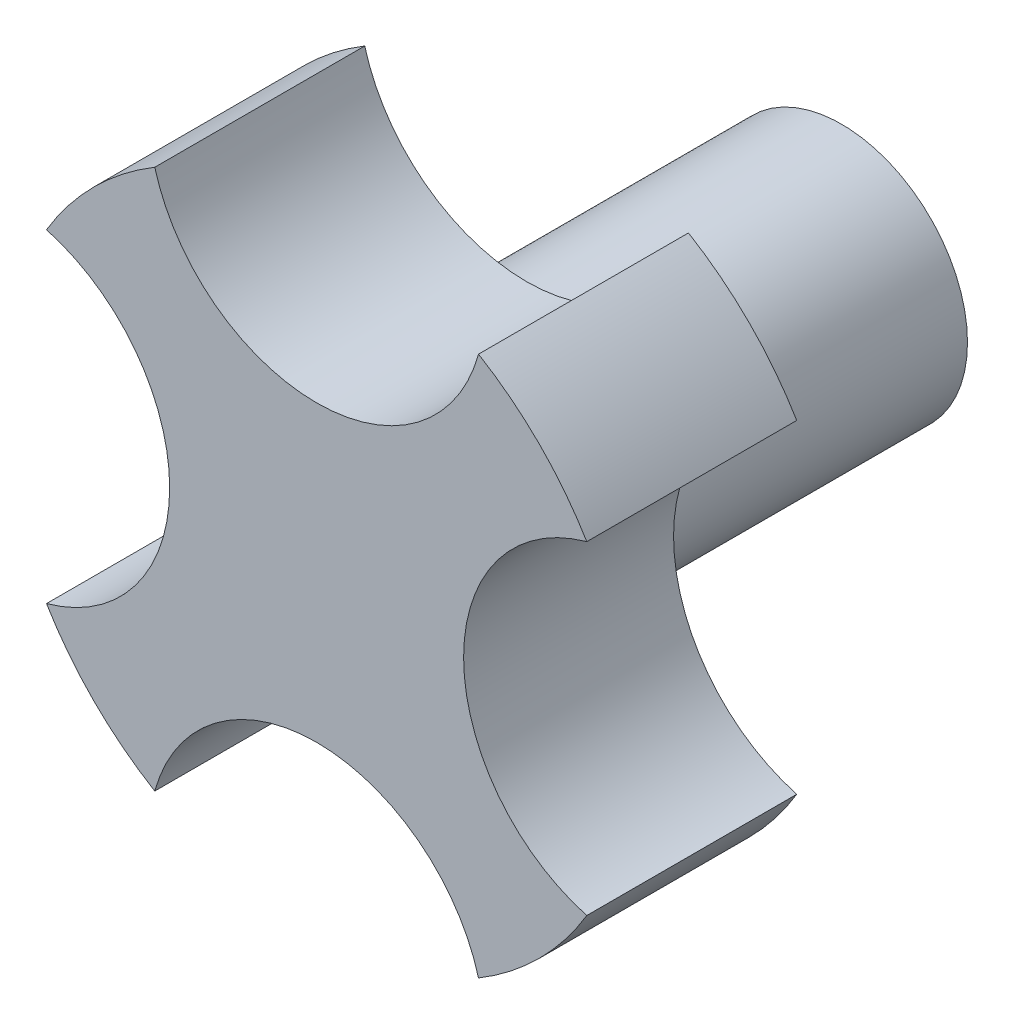
ISO-10303-21;
HEADER;
FILE_DESCRIPTION(('STEP AP214'),'2;1');
FILE_NAME('part.step','',(''),(''),'','','');
FILE_SCHEMA(('AUTOMOTIVE_DESIGN { 1 0 10303 214 1 1 1 1 }'));
ENDSEC;
DATA;
#1=APPLICATION_CONTEXT('core data for automotive mechanical design processes');
#2=APPLICATION_PROTOCOL_DEFINITION('international standard','automotive_design',2000,#1);
#3=PRODUCT_CONTEXT('',#1,'mechanical');
#4=PRODUCT('Part','Part','',(#3));
#5=PRODUCT_RELATED_PRODUCT_CATEGORY('part','',(#4));
#6=PRODUCT_DEFINITION_FORMATION('','',#4);
#7=PRODUCT_DEFINITION_CONTEXT('part definition',#1,'design');
#8=PRODUCT_DEFINITION('design','',#6,#7);
#9=PRODUCT_DEFINITION_SHAPE('','',#8);
#10=(LENGTH_UNIT() NAMED_UNIT(*) SI_UNIT(.MILLI.,.METRE.));
#11=(NAMED_UNIT(*) PLANE_ANGLE_UNIT() SI_UNIT($,.RADIAN.));
#12=(NAMED_UNIT(*) SI_UNIT($,.STERADIAN.) SOLID_ANGLE_UNIT());
#13=UNCERTAINTY_MEASURE_WITH_UNIT(LENGTH_MEASURE(1.E-05),#10,'distance_accuracy_value','');
#14=(GEOMETRIC_REPRESENTATION_CONTEXT(3) GLOBAL_UNCERTAINTY_ASSIGNED_CONTEXT((#13)) GLOBAL_UNIT_ASSIGNED_CONTEXT((#10,
#11,#12)) REPRESENTATION_CONTEXT('',''));
#15=CARTESIAN_POINT('',(0.,0.,0.));
#16=DIRECTION('',(0.,0.,1.));
#17=DIRECTION('',(1.,0.,0.));
#18=AXIS2_PLACEMENT_3D('',#15,#16,#17);
#19=CARTESIAN_POINT('',(0.,0.,0.));
#20=DIRECTION('',(0.,0.,1.));
#21=DIRECTION('',(1.,0.,0.));
#22=AXIS2_PLACEMENT_3D('',#19,#20,#21);
#23=PLANE('',#22);
#24=CARTESIAN_POINT('',(0.,0.,0.));
#25=DIRECTION('',(0.,0.,1.));
#26=DIRECTION('',(1.,0.,0.));
#27=AXIS2_PLACEMENT_3D('',#24,#25,#26);
#28=CIRCLE('',#27,6.);
#29=CARTESIAN_POINT('',(6.,0.,0.));
#30=VERTEX_POINT('',#29);
#31=EDGE_CURVE('E51',#30,#30,#28,.T.);
#32=ORIENTED_EDGE('',*,*,#31,.F.);
#33=EDGE_LOOP('',(#32));
#34=FACE_BOUND('',#33,.T.);
#35=CARTESIAN_POINT('',(0.,0.,0.));
#36=DIRECTION('',(0.,0.,1.));
#37=DIRECTION('',(1.,0.,0.));
#38=AXIS2_PLACEMENT_3D('',#35,#36,#37);
#39=CIRCLE('',#38,4.);
#40=CARTESIAN_POINT('',(4.,0.,0.));
#41=VERTEX_POINT('',#40);
#42=EDGE_CURVE('E174',#41,#41,#39,.T.);
#43=ORIENTED_EDGE('',*,*,#42,.T.);
#44=EDGE_LOOP('',(#43));
#45=FACE_BOUND('',#44,.T.);
#46=ADVANCED_FACE('F35',(#34,#45),#23,.F.);
#47=CARTESIAN_POINT('',(0.,0.,15.));
#48=DIRECTION('',(0.,0.,-1.));
#49=DIRECTION('',(-1.,0.,0.));
#50=AXIS2_PLACEMENT_3D('',#47,#48,#49);
#51=CYLINDRICAL_SURFACE('',#50,6.);
#52=CARTESIAN_POINT('',(-6.,0.,9.));
#53=CARTESIAN_POINT('',(-5.99999859868013,-0.0828760886697312,8.99999767426184));
#54=CARTESIAN_POINT('',(-5.99826578131828,-0.165778157830763,8.99310844922621));
#55=CARTESIAN_POINT('',(-5.99152113829892,-0.329206323770533,8.96577484869299));
#56=CARTESIAN_POINT('',(-5.98650745419968,-0.409731046870739,8.94532279046215));
#57=CARTESIAN_POINT('',(-5.9737562633204,-0.566020872182576,8.8915607465379));
#58=CARTESIAN_POINT('',(-5.96602202842087,-0.641791563430002,8.85826620128471));
#59=CARTESIAN_POINT('',(-5.94865343807593,-0.786672131904424,8.77981860995515));
#60=CARTESIAN_POINT('',(-5.9390190185405,-0.855781784348756,8.73466516388105));
#61=CARTESIAN_POINT('',(-5.91867413591801,-0.986801927300915,8.63279921034577));
#62=CARTESIAN_POINT('',(-5.90794707148533,-1.04855569006107,8.57588842504081));
#63=CARTESIAN_POINT('',(-5.8867362011753,-1.1617489272033,8.45254779509107));
#64=CARTESIAN_POINT('',(-5.87625242288349,-1.21318723694913,8.38611687705349));
#65=CARTESIAN_POINT('',(-5.85654775699711,-1.30502654279902,8.24440477326254));
#66=CARTESIAN_POINT('',(-5.84734794470605,-1.34525221592535,8.16900676918957));
#67=CARTESIAN_POINT('',(-5.83149494812224,-1.41239690855051,8.01225158834162));
#68=CARTESIAN_POINT('',(-5.82484135672789,-1.43931805543932,7.93089536667422));
#69=CARTESIAN_POINT('',(-5.81500476717551,-1.47855483680427,7.7662565017975));
#70=CARTESIAN_POINT('',(-5.81175491075426,-1.49115226833332,7.68304510395018));
#71=CARTESIAN_POINT('',(-5.80889362537741,-1.50226177506783,7.515631430986));
#72=CARTESIAN_POINT('',(-5.80928160448644,-1.50077614181796,7.43142931930137));
#73=CARTESIAN_POINT('',(-5.81359205496619,-1.48398652463926,7.2665841922555));
#74=CARTESIAN_POINT('',(-5.8174286300188,-1.46901834019049,7.18590437853488));
#75=CARTESIAN_POINT('',(-5.82806709676484,-1.42622418690308,7.02823894908868));
#76=CARTESIAN_POINT('',(-5.83486919970697,-1.39839730206939,6.95125359697099));
#77=CARTESIAN_POINT('',(-5.85075113904187,-1.33038947793712,6.80226198374791));
#78=CARTESIAN_POINT('',(-5.85985327469422,-1.29008666723288,6.73031382821043));
#79=CARTESIAN_POINT('',(-5.87929710846387,-1.19835627601492,6.59408129024314));
#80=CARTESIAN_POINT('',(-5.88963902334736,-1.1469267488088,6.52979825193273));
#81=CARTESIAN_POINT('',(-5.91075880539782,-1.03266342468118,6.40879638430558));
#82=CARTESIAN_POINT('',(-5.92154069477972,-0.969546258165819,6.35234550993863));
#83=CARTESIAN_POINT('',(-5.94205965578786,-0.834611917503658,6.25077875753608));
#84=CARTESIAN_POINT('',(-5.95179669549416,-0.762794477707901,6.20566322573642));
#85=CARTESIAN_POINT('',(-5.96917732094183,-0.612115888681348,6.1279494137756));
#86=CARTESIAN_POINT('',(-5.97681360127726,-0.533231393208579,6.09539465974556));
#87=CARTESIAN_POINT('',(-5.98907916991419,-0.370876008142837,6.04408269429042));
#88=CARTESIAN_POINT('',(-5.99370903339281,-0.287405999150439,6.02532284358186));
#89=CARTESIAN_POINT('',(-5.99935499271375,-0.120539970389981,6.00254243444116));
#90=CARTESIAN_POINT('',(-6.00046053508279,-0.0371967199881637,5.9981569739247));
#91=CARTESIAN_POINT('',(-5.99918804814451,0.129032874801554,6.00324900205549));
#92=CARTESIAN_POINT('',(-5.99681033241846,0.21191925964464,6.01272524279914));
#93=CARTESIAN_POINT('',(-5.98889581127357,0.373614268776536,6.04497090839138));
#94=CARTESIAN_POINT('',(-5.98340634185811,0.452465118968799,6.06754126347699));
#95=CARTESIAN_POINT('',(-5.96988706634134,0.605257292452555,6.12510708402846));
#96=CARTESIAN_POINT('',(-5.96185700369892,0.679198119032677,6.16010380431318));
#97=CARTESIAN_POINT('',(-5.9439330792631,0.821523134429889,6.24223612887474));
#98=CARTESIAN_POINT('',(-5.93400867366931,0.889785441835871,6.28957611239678));
#99=CARTESIAN_POINT('',(-5.91344509187419,1.01752661364329,6.39478990879699));
#100=CARTESIAN_POINT('',(-5.90280579251704,1.07700395897305,6.45266553961692));
#101=CARTESIAN_POINT('',(-5.8816895696077,1.18699056807277,6.57900196084448));
#102=CARTESIAN_POINT('',(-5.8712230418728,1.23724386762207,6.64768770300244));
#103=CARTESIAN_POINT('',(-5.85192878377238,1.32551075901273,6.79273263446574));
#104=CARTESIAN_POINT('',(-5.84310098067025,1.36352489415797,6.86909148295977));
#105=CARTESIAN_POINT('',(-5.82818094734664,1.42595142060932,7.0269057224131));
#106=CARTESIAN_POINT('',(-5.82207255291905,1.45044439665409,7.10832762834403));
#107=CARTESIAN_POINT('',(-5.81326744090183,1.4853456599538,7.27430963788913));
#108=CARTESIAN_POINT('',(-5.81056997719936,1.49575702747868,7.35886905103251));
#109=CARTESIAN_POINT('',(-5.80894901203956,1.50203859033402,7.52612102385523));
#110=CARTESIAN_POINT('',(-5.80991932728263,1.49831789778014,7.60879743512475));
#111=CARTESIAN_POINT('',(-5.81527909007842,1.47737727831288,7.772303888668));
#112=CARTESIAN_POINT('',(-5.81966846891856,1.46015762268679,7.85313396801367));
#113=CARTESIAN_POINT('',(-5.83131260682722,1.41293131944281,8.01020845906543));
#114=CARTESIAN_POINT('',(-5.83855015236309,1.38300140468039,8.08647730524023));
#115=CARTESIAN_POINT('',(-5.85507755724829,1.31126491360508,8.23296538271371));
#116=CARTESIAN_POINT('',(-5.86436770120773,1.2694566900342,8.30318377318694));
#117=CARTESIAN_POINT('',(-5.88425634263512,1.17386774863714,8.43755462900204));
#118=CARTESIAN_POINT('',(-5.89488264831757,1.11980316291226,8.50150107342398));
#119=CARTESIAN_POINT('',(-5.91608027246286,1.00178937118974,8.61954704479542));
#120=CARTESIAN_POINT('',(-5.9266515772706,0.93783782126115,8.67364423011298));
#121=CARTESIAN_POINT('',(-5.94677655647663,0.800467586702593,8.77141130856462));
#122=CARTESIAN_POINT('',(-5.95630833365868,0.726898422316388,8.81487461367159));
#123=CARTESIAN_POINT('',(-5.97304924975118,0.573266059510476,8.88874746294054));
#124=CARTESIAN_POINT('',(-5.98026005199781,0.493207563436739,8.91916636064854));
#125=CARTESIAN_POINT('',(-5.99048059565542,0.344410253243471,8.96157183032966));
#126=CARTESIAN_POINT('',(-5.99402585052691,0.276380170908067,8.97595124305344));
#127=CARTESIAN_POINT('',(-5.99878605231948,0.138906071536282,8.99516594362194));
#128=CARTESIAN_POINT('',(-6.00000117450894,0.0694621612426158,9.0000019493053));
#129=CARTESIAN_POINT('',(-6.,0.,9.));
#130=B_SPLINE_CURVE_WITH_KNOTS('',3,(#52,#53,#54,#55,#56,#57,#58,#59,#60,#61,#62,#63,#64,#65,
#66,#67,#68,#69,#70,#71,#72,#73,#74,#75,#76,#77,#78,#79,#80,#81,#82,#83,#84,#85,#86,#87,#88,#89,
#90,#91,#92,#93,#94,#95,#96,#97,#98,#99,#100,#101,#102,#103,#104,#105,#106,#107,#108,#109,#110,
#111,#112,#113,#114,#115,#116,#117,#118,#119,#120,#121,#122,#123,#124,#125,#126,#127,#128,#129),
.UNSPECIFIED.,.T.,.F.,(4,2,2,2,2,2,2,2,2,2,2,2,2,2,2,2,2,2,2,2,2,2,2,2,2,2,2,2,2,2,2,2,2,2,2,2,
2,2,4),(0.,0.24837371247189,0.4968882377639,0.745104902286106,0.993329940169328,
1.24614435437139,1.49898729580062,1.75558647545807,2.01214461169368,2.2635629509943,
2.51494038112697,2.76022497007018,3.00552703466039,3.25330527873879,3.50112690836163,
3.7560150096902,4.01091089558247,4.26668229009114,4.52240473688643,4.77158308949276,
5.02073901112743,5.26620274514038,5.51169127322291,5.76153587565352,6.01142363008019,
6.26744509204476,6.52345518749508,6.77792254614037,7.03233423252408,7.27943780398613,
7.52653640956034,7.77216400559447,8.01782568136901,8.2698957640991,8.52202569770418,
8.77872185499588,9.0352336382135,9.24342242942149,9.4515955604304),.UNSPECIFIED.);
#131=CARTESIAN_POINT('',(-6.,0.,9.));
#132=VERTEX_POINT('',#131);
#133=EDGE_CURVE('E184',#132,#132,#130,.T.);
#134=ORIENTED_EDGE('',*,*,#133,.T.);
#135=EDGE_LOOP('',(#134));
#136=FACE_BOUND('',#135,.T.);
#137=CARTESIAN_POINT('',(0.,-6.,9.));
#138=CARTESIAN_POINT('',(0.0828760886697298,-5.99999859868013,8.99999767426184));
#139=CARTESIAN_POINT('',(0.165778157830762,-5.99826578131828,8.99310844922621));
#140=CARTESIAN_POINT('',(0.329206323770531,-5.99152113829892,8.96577484869299));
#141=CARTESIAN_POINT('',(0.409731046870738,-5.98650745419968,8.94532279046215));
#142=CARTESIAN_POINT('',(0.566020872182576,-5.9737562633204,8.89156074653791));
#143=CARTESIAN_POINT('',(0.641791563430002,-5.96602202842087,8.85826620128472));
#144=CARTESIAN_POINT('',(0.786672131904425,-5.94865343807593,8.77981860995517));
#145=CARTESIAN_POINT('',(0.855781784348758,-5.9390190185405,8.73466516388106));
#146=CARTESIAN_POINT('',(0.986801927300919,-5.91867413591801,8.63279921034579));
#147=CARTESIAN_POINT('',(1.04855569006107,-5.90794707148533,8.57588842504082));
#148=CARTESIAN_POINT('',(1.1617489272033,-5.8867362011753,8.45254779509108));
#149=CARTESIAN_POINT('',(1.21318723694913,-5.87625242288349,8.3861168770535));
#150=CARTESIAN_POINT('',(1.30502654279903,-5.8565477569971,8.24440477326256));
#151=CARTESIAN_POINT('',(1.34525221592536,-5.84734794470605,8.1690067691896));
#152=CARTESIAN_POINT('',(1.41239690855053,-5.83149494812223,8.01225158834164));
#153=CARTESIAN_POINT('',(1.43931805543933,-5.82484135672789,7.93089536667424));
#154=CARTESIAN_POINT('',(1.47855483680429,-5.81500476717551,7.76625650179753));
#155=CARTESIAN_POINT('',(1.49115226833334,-5.81175491075426,7.6830451039502));
#156=CARTESIAN_POINT('',(1.50226177506785,-5.80889362537741,7.51563143098602));
#157=CARTESIAN_POINT('',(1.50077614181798,-5.80928160448644,7.43142931930139));
#158=CARTESIAN_POINT('',(1.48398652463928,-5.81359205496618,7.26658419225552));
#159=CARTESIAN_POINT('',(1.46901834019052,-5.81742863001879,7.1859043785349));
#160=CARTESIAN_POINT('',(1.42622418690311,-5.82806709676484,7.02823894908871));
#161=CARTESIAN_POINT('',(1.39839730206942,-5.83486919970697,6.95125359697102));
#162=CARTESIAN_POINT('',(1.33038947793715,-5.85075113904187,6.80226198374793));
#163=CARTESIAN_POINT('',(1.29008666723291,-5.85985327469421,6.73031382821045));
#164=CARTESIAN_POINT('',(1.19835627601495,-5.87929710846386,6.59408129024316));
#165=CARTESIAN_POINT('',(1.14692674880884,-5.88963902334735,6.52979825193274));
#166=CARTESIAN_POINT('',(1.03266342468122,-5.91075880539781,6.4087963843056));
#167=CARTESIAN_POINT('',(0.969546258165859,-5.92154069477971,6.35234550993865));
#168=CARTESIAN_POINT('',(0.834611917503699,-5.94205965578786,6.2507787575361));
#169=CARTESIAN_POINT('',(0.762794477707943,-5.95179669549415,6.20566322573643));
#170=CARTESIAN_POINT('',(0.612115888681391,-5.96917732094183,6.12794941377561));
#171=CARTESIAN_POINT('',(0.533231393208622,-5.97681360127725,6.09539465974557));
#172=CARTESIAN_POINT('',(0.370876008142882,-5.98907916991419,6.04408269429043));
#173=CARTESIAN_POINT('',(0.287405999150483,-5.99370903339281,6.02532284358186));
#174=CARTESIAN_POINT('',(0.120539970390025,-5.99935499271375,6.00254243444116));
#175=CARTESIAN_POINT('',(0.0371967199882082,-6.00046053508279,5.9981569739247));
#176=CARTESIAN_POINT('',(-0.129032874801509,-5.99918804814451,6.00324900205549));
#177=CARTESIAN_POINT('',(-0.211919259644596,-5.99681033241847,6.01272524279913));
#178=CARTESIAN_POINT('',(-0.373614268776493,-5.98889581127357,6.04497090839138));
#179=CARTESIAN_POINT('',(-0.452465118968755,-5.98340634185811,6.06754126347699));
#180=CARTESIAN_POINT('',(-0.605257292452512,-5.96988706634134,6.12510708402845));
#181=CARTESIAN_POINT('',(-0.679198119032636,-5.96185700369892,6.16010380431317));
#182=CARTESIAN_POINT('',(-0.821523134429848,-5.9439330792631,6.24223612887473));
#183=CARTESIAN_POINT('',(-0.889785441835832,-5.93400867366932,6.28957611239676));
#184=CARTESIAN_POINT('',(-1.01752661364325,-5.91344509187419,6.39478990879697));
#185=CARTESIAN_POINT('',(-1.07700395897301,-5.90280579251705,6.45266553961691));
#186=CARTESIAN_POINT('',(-1.18699056807273,-5.88168956960771,6.57900196084446));
#187=CARTESIAN_POINT('',(-1.23724386762203,-5.87122304187281,6.64768770300242));
#188=CARTESIAN_POINT('',(-1.3255107590127,-5.85192878377239,6.79273263446572));
#189=CARTESIAN_POINT('',(-1.36352489415794,-5.84310098067026,6.86909148295975));
#190=CARTESIAN_POINT('',(-1.42595142060929,-5.82818094734665,7.02690572241308));
#191=CARTESIAN_POINT('',(-1.45044439665407,-5.82207255291906,7.10832762834401));
#192=CARTESIAN_POINT('',(-1.48534565995378,-5.81326744090184,7.27430963788911));
#193=CARTESIAN_POINT('',(-1.49575702747866,-5.81056997719936,7.35886905103249));
#194=CARTESIAN_POINT('',(-1.502038590334,-5.80894901203957,7.5261210238552));
#195=CARTESIAN_POINT('',(-1.49831789778012,-5.80991932728264,7.60879743512473));
#196=CARTESIAN_POINT('',(-1.47737727831287,-5.81527909007843,7.77230388866798));
#197=CARTESIAN_POINT('',(-1.46015762268677,-5.81966846891857,7.85313396801365));
#198=CARTESIAN_POINT('',(-1.4129313194428,-5.83131260682723,8.01020845906541));
#199=CARTESIAN_POINT('',(-1.38300140468038,-5.8385501523631,8.08647730524021));
#200=CARTESIAN_POINT('',(-1.31126491360507,-5.85507755724829,8.23296538271369));
#201=CARTESIAN_POINT('',(-1.26945669003419,-5.86436770120773,8.30318377318692));
#202=CARTESIAN_POINT('',(-1.17386774863714,-5.88425634263512,8.43755462900202));
#203=CARTESIAN_POINT('',(-1.11980316291226,-5.89488264831757,8.50150107342396));
#204=CARTESIAN_POINT('',(-1.00178937118974,-5.91608027246286,8.61954704479541));
#205=CARTESIAN_POINT('',(-0.937837821261147,-5.9266515772706,8.67364423011297));
#206=CARTESIAN_POINT('',(-0.800467586702592,-5.94677655647663,8.77141130856461));
#207=CARTESIAN_POINT('',(-0.726898422316389,-5.95630833365868,8.81487461367158));
#208=CARTESIAN_POINT('',(-0.573266059510478,-5.97304924975118,8.88874746294053));
#209=CARTESIAN_POINT('',(-0.493207563436742,-5.98026005199781,8.91916636064854));
#210=CARTESIAN_POINT('',(-0.344410253243473,-5.99048059565542,8.96157183032965));
#211=CARTESIAN_POINT('',(-0.27638017090807,-5.99402585052691,8.97595124305343));
#212=CARTESIAN_POINT('',(-0.138906071536285,-5.99878605231948,8.99516594362194));
#213=CARTESIAN_POINT('',(-0.0694621612426177,-6.00000117450894,9.0000019493053));
#214=CARTESIAN_POINT('',(0.,-6.,9.));
#215=B_SPLINE_CURVE_WITH_KNOTS('',3,(#137,#138,#139,#140,#141,#142,#143,#144,#145,#146,#147,
#148,#149,#150,#151,#152,#153,#154,#155,#156,#157,#158,#159,#160,#161,#162,#163,#164,#165,#166,
#167,#168,#169,#170,#171,#172,#173,#174,#175,#176,#177,#178,#179,#180,#181,#182,#183,#184,#185,
#186,#187,#188,#189,#190,#191,#192,#193,#194,#195,#196,#197,#198,#199,#200,#201,#202,#203,#204,
#205,#206,#207,#208,#209,#210,#211,#212,#213,#214),.UNSPECIFIED.,.T.,.F.,(4,2,2,2,2,2,2,2,2,2,2,
2,2,2,2,2,2,2,2,2,2,2,2,2,2,2,2,2,2,2,2,2,2,2,2,2,2,2,4),(0.,0.24837371247189,0.4968882377639,
0.745104902286105,0.993329940169327,1.24614435437139,1.49898729580062,1.75558647545807,
2.01214461169368,2.2635629509943,2.51494038112697,2.76022497007018,3.00552703466038,
3.25330527873879,3.50112690836163,3.75601500969019,4.01091089558247,4.26668229009114,
4.52240473688643,4.77158308949276,5.02073901112743,5.26620274514037,5.5116912732229,
5.76153587565352,6.01142363008019,6.26744509204476,6.52345518749508,6.77792254614036,
7.03233423252408,7.27943780398612,7.52653640956034,7.77216400559447,8.01782568136901,
8.2698957640991,8.52202569770417,8.77872185499588,9.0352336382135,9.24342242942149,
9.45159556043039),.UNSPECIFIED.);
#216=CARTESIAN_POINT('',(0.,-6.,9.));
#217=VERTEX_POINT('',#216);
#218=EDGE_CURVE('E143',#217,#217,#215,.T.);
#219=ORIENTED_EDGE('',*,*,#218,.T.);
#220=EDGE_LOOP('',(#219));
#221=FACE_BOUND('',#220,.T.);
#222=CARTESIAN_POINT('',(0.,0.,15.));
#223=DIRECTION('',(0.,0.,1.));
#224=DIRECTION('',(1.,0.,0.));
#225=AXIS2_PLACEMENT_3D('',#222,#223,#224);
#226=CIRCLE('',#225,6.);
#227=CARTESIAN_POINT('',(6.,0.,15.));
#228=VERTEX_POINT('',#227);
#229=EDGE_CURVE('E11',#228,#228,#226,.T.);
#230=ORIENTED_EDGE('',*,*,#229,.F.);
#231=EDGE_LOOP('',(#230));
#232=FACE_BOUND('',#231,.T.);
#233=ORIENTED_EDGE('',*,*,#31,.T.);
#234=EDGE_LOOP('',(#233));
#235=FACE_BOUND('',#234,.T.);
#236=ADVANCED_FACE('F37',(#136,#221,#232,#235),#51,.T.);
#237=CARTESIAN_POINT('',(0.,0.,15.));
#238=DIRECTION('',(0.,0.,-1.));
#239=DIRECTION('',(-1.,0.,0.));
#240=AXIS2_PLACEMENT_3D('',#237,#238,#239);
#241=CYLINDRICAL_SURFACE('',#240,4.);
#242=CARTESIAN_POINT('',(-4.,0.,9.));
#243=CARTESIAN_POINT('',(-4.00000217456151,-0.081235058937853,9.00000290230311));
#244=CARTESIAN_POINT('',(-3.99750379283184,-0.162450241781792,8.99338023975162));
#245=CARTESIAN_POINT('',(-3.98778696006928,-0.322453452352361,8.96717180473007));
#246=CARTESIAN_POINT('',(-3.98056918893993,-0.401241827987616,8.94758789952943));
#247=CARTESIAN_POINT('',(-3.96218832391545,-0.554060784990878,8.89624699822823));
#248=CARTESIAN_POINT('',(-3.9510328434944,-0.628100224162277,8.86451348317821));
#249=CARTESIAN_POINT('',(-3.92588767765353,-0.769799310160253,8.78989358698417));
#250=CARTESIAN_POINT('',(-3.91189723227548,-0.837457239177878,8.74700421445583));
#251=CARTESIAN_POINT('',(-3.88186246971217,-0.967346417045823,8.64938746892908));
#252=CARTESIAN_POINT('',(-3.86576002583566,-1.02927073015119,8.59426973774059));
#253=CARTESIAN_POINT('',(-3.83360220871327,-1.14324421474363,8.47458956534114));
#254=CARTESIAN_POINT('',(-3.81754685135033,-1.19529036359202,8.41002424391211));
#255=CARTESIAN_POINT('',(-3.78662470617732,-1.28998202215984,8.27028253247678));
#256=CARTESIAN_POINT('',(-3.77182648820819,-1.33219393195759,8.19479563345416));
#257=CARTESIAN_POINT('',(-3.74599860237434,-1.40318646334083,8.03715164583146));
#258=CARTESIAN_POINT('',(-3.73496742975881,-1.43197244961238,7.95499723684488));
#259=CARTESIAN_POINT('',(-3.71854412824136,-1.47408431017548,7.78988325974178));
#260=CARTESIAN_POINT('',(-3.71293924350838,-1.48799593218557,7.70709496156454));
#261=CARTESIAN_POINT('',(-3.70738061461215,-1.50179556531647,7.54018384200614));
#262=CARTESIAN_POINT('',(-3.70742453659305,-1.50168936802629,7.45606158612551));
#263=CARTESIAN_POINT('',(-3.71297511632055,-1.48790429610016,7.29423047478703));
#264=CARTESIAN_POINT('',(-3.71815468871122,-1.47503808509002,7.21643909395581));
#265=CARTESIAN_POINT('',(-3.7328493805953,-1.43744167868328,7.06421284959467));
#266=CARTESIAN_POINT('',(-3.74236515298864,-1.41270969663256,6.9897784933861));
#267=CARTESIAN_POINT('',(-3.76485702190254,-1.35163748571902,6.84472293227175));
#268=CARTESIAN_POINT('',(-3.77789517988167,-1.31508648737098,6.77420051387868));
#269=CARTESIAN_POINT('',(-3.8059421013932,-1.23156073762695,6.64005426240901));
#270=CARTESIAN_POINT('',(-3.82095154457158,-1.18458238728894,6.57643282248029));
#271=CARTESIAN_POINT('',(-3.85248038859114,-1.07781780766546,6.45339633634911));
#272=CARTESIAN_POINT('',(-3.86903347455671,-1.01738298716953,6.3945513592519));
#273=CARTESIAN_POINT('',(-3.90091728164086,-0.887312590818992,6.28766203379419));
#274=CARTESIAN_POINT('',(-3.91624781465953,-0.817675603497334,6.23961934539432));
#275=CARTESIAN_POINT('',(-3.9442639480908,-0.669723436992388,6.15506960293747));
#276=CARTESIAN_POINT('',(-3.95690498259616,-0.591290713844687,6.11875241877893));
#277=CARTESIAN_POINT('',(-3.97778718326962,-0.42883685052455,6.06001739572995));
#278=CARTESIAN_POINT('',(-3.98603030341493,-0.344818210845734,6.03759338343888));
#279=CARTESIAN_POINT('',(-3.99684443228065,-0.178375243148632,6.00837721245806));
#280=CARTESIAN_POINT('',(-3.99969369025686,-0.0961036195621762,6.00081739361749));
#281=CARTESIAN_POINT('',(-4.00025893700126,0.0685724752550568,5.99930893610008));
#282=CARTESIAN_POINT('',(-3.99797606386863,0.150976912983405,6.00535727968323));
#283=CARTESIAN_POINT('',(-3.98871709772643,0.310262048561891,6.03031004230867));
#284=CARTESIAN_POINT('',(-3.98192470962305,0.387233328007367,6.04871154373709));
#285=CARTESIAN_POINT('',(-3.96451477091717,0.536941754957251,6.09718607254733));
#286=CARTESIAN_POINT('',(-3.9538967228203,0.609678350347565,6.12726061794804));
#287=CARTESIAN_POINT('',(-3.92949624407681,0.751247765110185,6.19918641243948));
#288=CARTESIAN_POINT('',(-3.91563000209348,0.819903083557824,6.24135772922339));
#289=CARTESIAN_POINT('',(-3.88626671564663,0.949392711726654,6.33591810317157));
#290=CARTESIAN_POINT('',(-3.87076907009515,1.01022412027048,6.38831093254516));
#291=CARTESIAN_POINT('',(-3.83873329490989,1.12603079874457,6.50540412212429));
#292=CARTESIAN_POINT('',(-3.82218696503729,1.18046154123571,6.57064218277271));
#293=CARTESIAN_POINT('',(-3.79078815746853,1.27771050031906,6.70965138470767));
#294=CARTESIAN_POINT('',(-3.77593583194399,1.32052767414521,6.78342329138852));
#295=CARTESIAN_POINT('',(-3.74966829822462,1.39337773519,6.93801598677233));
#296=CARTESIAN_POINT('',(-3.73826760328493,1.4233568544692,7.01886474591045));
#297=CARTESIAN_POINT('',(-3.72054032891004,1.46907883466891,7.18500976368784));
#298=CARTESIAN_POINT('',(-3.7142106105749,1.48483050305537,7.27030323619814));
#299=CARTESIAN_POINT('',(-3.70775894792573,1.50086347097841,7.43701615954113));
#300=CARTESIAN_POINT('',(-3.7072644452334,1.50207331495839,7.5183326317169));
#301=CARTESIAN_POINT('',(-3.71158412745292,1.49136715641594,7.67994531627618));
#302=CARTESIAN_POINT('',(-3.71639780898898,1.47945239850125,7.7602416246716));
#303=CARTESIAN_POINT('',(-3.73048141585432,1.44355815630243,7.91504722671657));
#304=CARTESIAN_POINT('',(-3.73961085376663,1.41995798316525,7.98965834624536));
#305=CARTESIAN_POINT('',(-3.76121548297844,1.3616969677992,8.13390550849443));
#306=CARTESIAN_POINT('',(-3.77369151995214,1.32703332944945,8.20354028807015));
#307=CARTESIAN_POINT('',(-3.80139723903964,1.24552075938154,8.33982678969764));
#308=CARTESIAN_POINT('',(-3.81673698440964,1.19812832803011,8.40613079679992));
#309=CARTESIAN_POINT('',(-3.84806246757177,1.09334485729906,8.53014156097121));
#310=CARTESIAN_POINT('',(-3.86404840943145,1.03595064012808,8.58784557478676));
#311=CARTESIAN_POINT('',(-3.89590424609881,0.909080396784624,8.69620195582185));
#312=CARTESIAN_POINT('',(-3.91172104900645,0.839118644212992,8.74630375343468));
#313=CARTESIAN_POINT('',(-3.94054514457031,0.69121322320082,8.83402265527656));
#314=CARTESIAN_POINT('',(-3.95355221851559,0.613268934090619,8.87163878773637));
#315=CARTESIAN_POINT('',(-3.9757429260668,0.44799908200231,8.93437682904833));
#316=CARTESIAN_POINT('',(-3.98473657158356,0.360413422234206,8.9588870646019));
#317=CARTESIAN_POINT('',(-3.99686242179587,0.181875733606381,8.99169295992068));
#318=CARTESIAN_POINT('',(-3.99999756603967,0.0909254163648584,8.99999675148732));
#319=CARTESIAN_POINT('',(-4.,0.,9.));
#320=B_SPLINE_CURVE_WITH_KNOTS('',3,(#242,#243,#244,#245,#246,#247,#248,#249,#250,#251,#252,
#253,#254,#255,#256,#257,#258,#259,#260,#261,#262,#263,#264,#265,#266,#267,#268,#269,#270,#271,
#272,#273,#274,#275,#276,#277,#278,#279,#280,#281,#282,#283,#284,#285,#286,#287,#288,#289,#290,
#291,#292,#293,#294,#295,#296,#297,#298,#299,#300,#301,#302,#303,#304,#305,#306,#307,#308,#309,
#310,#311,#312,#313,#314,#315,#316,#317,#318,#319),.UNSPECIFIED.,.T.,.F.,(4,2,2,2,2,2,2,2,2,2,2,
2,2,2,2,2,2,2,2,2,2,2,2,2,2,2,2,2,2,2,2,2,2,2,2,2,2,2,4),(0.,0.24336980156056,0.486704549530461,
0.729571369213574,0.972503379609491,1.22473618582716,1.47704604925622,1.73896674501659,
2.00078269352134,2.25185874416902,2.50283106079707,2.73878345119971,2.97477138060589,
3.21522408387018,3.45575990744259,3.71246153335813,3.96920257905066,4.22991375286076,
4.49050899698846,4.73725019635926,4.98393668390521,5.2211443792384,5.45838293254454,
5.702592218596,5.94689180019868,6.20536519455658,6.46386178920141,6.72343066727204,
6.98283874956507,7.22558763480252,7.46831350211259,7.70363142426533,7.93900886656507,
8.18672471884271,8.43451941997062,8.69572329654039,8.95694749805102,9.22948515032042,
9.50188601796128),.UNSPECIFIED.);
#321=CARTESIAN_POINT('',(-4.,0.,9.));
#322=VERTEX_POINT('',#321);
#323=EDGE_CURVE('E40',#322,#322,#320,.T.);
#324=ORIENTED_EDGE('',*,*,#323,.F.);
#325=EDGE_LOOP('',(#324));
#326=FACE_BOUND('',#325,.T.);
#327=CARTESIAN_POINT('',(0.,-4.,9.));
#328=CARTESIAN_POINT('',(0.0812350589378515,-4.00000217456151,9.00000290230311));
#329=CARTESIAN_POINT('',(0.162450241781791,-3.99750379283184,8.99338023975162));
#330=CARTESIAN_POINT('',(0.322453452352359,-3.98778696006928,8.96717180473007));
#331=CARTESIAN_POINT('',(0.401241827987614,-3.98056918893993,8.94758789952943));
#332=CARTESIAN_POINT('',(0.554060784990877,-3.96218832391545,8.89624699822824));
#333=CARTESIAN_POINT('',(0.628100224162276,-3.9510328434944,8.86451348317821));
#334=CARTESIAN_POINT('',(0.769799310160252,-3.92588767765353,8.78989358698418));
#335=CARTESIAN_POINT('',(0.837457239177878,-3.91189723227548,8.74700421445585));
#336=CARTESIAN_POINT('',(0.967346417045824,-3.88186246971217,8.64938746892909));
#337=CARTESIAN_POINT('',(1.02927073015119,-3.86576002583566,8.5942697377406));
#338=CARTESIAN_POINT('',(1.14324421474363,-3.83360220871327,8.47458956534116));
#339=CARTESIAN_POINT('',(1.19529036359202,-3.81754685135033,8.41002424391213));
#340=CARTESIAN_POINT('',(1.28998202215985,-3.78662470617732,8.27028253247679));
#341=CARTESIAN_POINT('',(1.33219393195759,-3.77182648820819,8.19479563345418));
#342=CARTESIAN_POINT('',(1.40318646334084,-3.74599860237433,8.03715164583148));
#343=CARTESIAN_POINT('',(1.43197244961239,-3.73496742975881,7.9549972368449));
#344=CARTESIAN_POINT('',(1.47408431017549,-3.71854412824136,7.7898832597418));
#345=CARTESIAN_POINT('',(1.48799593218558,-3.71293924350838,7.70709496156456));
#346=CARTESIAN_POINT('',(1.50179556531648,-3.70738061461215,7.54018384200616));
#347=CARTESIAN_POINT('',(1.5016893680263,-3.70742453659305,7.45606158612553));
#348=CARTESIAN_POINT('',(1.48790429610018,-3.71297511632055,7.29423047478704));
#349=CARTESIAN_POINT('',(1.47503808509003,-3.71815468871122,7.21643909395582));
#350=CARTESIAN_POINT('',(1.4374416786833,-3.7328493805953,7.06421284959468));
#351=CARTESIAN_POINT('',(1.41270969663258,-3.74236515298863,6.98977849338612));
#352=CARTESIAN_POINT('',(1.35163748571904,-3.76485702190253,6.84472293227177));
#353=CARTESIAN_POINT('',(1.31508648737101,-3.77789517988166,6.7742005138787));
#354=CARTESIAN_POINT('',(1.23156073762698,-3.80594210139319,6.64005426240903));
#355=CARTESIAN_POINT('',(1.18458238728896,-3.82095154457158,6.5764328224803));
#356=CARTESIAN_POINT('',(1.07781780766549,-3.85248038859113,6.45339633634912));
#357=CARTESIAN_POINT('',(1.01738298716955,-3.86903347455671,6.39455135925191));
#358=CARTESIAN_POINT('',(0.887312590819019,-3.90091728164086,6.2876620337942));
#359=CARTESIAN_POINT('',(0.817675603497363,-3.91624781465952,6.23961934539433));
#360=CARTESIAN_POINT('',(0.669723436992418,-3.9442639480908,6.15506960293748));
#361=CARTESIAN_POINT('',(0.591290713844718,-3.95690498259616,6.11875241877894));
#362=CARTESIAN_POINT('',(0.428836850524582,-3.97778718326962,6.06001739572996));
#363=CARTESIAN_POINT('',(0.344818210845766,-3.98603030341493,6.03759338343888));
#364=CARTESIAN_POINT('',(0.178375243148664,-3.99684443228065,6.00837721245806));
#365=CARTESIAN_POINT('',(0.096103619562208,-3.99969369025686,6.00081739361749));
#366=CARTESIAN_POINT('',(-0.0685724752550255,-4.00025893700126,5.99930893610008));
#367=CARTESIAN_POINT('',(-0.150976912983374,-3.99797606386863,6.00535727968322));
#368=CARTESIAN_POINT('',(-0.310262048561861,-3.98871709772643,6.03031004230867));
#369=CARTESIAN_POINT('',(-0.387233328007337,-3.98192470962305,6.04871154373708));
#370=CARTESIAN_POINT('',(-0.536941754957222,-3.96451477091717,6.09718607254732));
#371=CARTESIAN_POINT('',(-0.609678350347536,-3.9538967228203,6.12726061794804));
#372=CARTESIAN_POINT('',(-0.751247765110157,-3.92949624407681,6.19918641243947));
#373=CARTESIAN_POINT('',(-0.819903083557797,-3.91563000209348,6.24135772922339));
#374=CARTESIAN_POINT('',(-0.949392711726627,-3.88626671564664,6.33591810317156));
#375=CARTESIAN_POINT('',(-1.01022412027045,-3.87076907009516,6.38831093254515));
#376=CARTESIAN_POINT('',(-1.12603079874454,-3.8387332949099,6.50540412212427));
#377=CARTESIAN_POINT('',(-1.18046154123569,-3.82218696503729,6.5706421827727));
#378=CARTESIAN_POINT('',(-1.27771050031903,-3.79078815746854,6.70965138470766));
#379=CARTESIAN_POINT('',(-1.32052767414519,-3.77593583194399,6.7834232913885));
#380=CARTESIAN_POINT('',(-1.39337773518998,-3.74966829822463,6.93801598677231));
#381=CARTESIAN_POINT('',(-1.42335685446918,-3.73826760328493,7.01886474591044));
#382=CARTESIAN_POINT('',(-1.46907883466889,-3.72054032891005,7.18500976368782));
#383=CARTESIAN_POINT('',(-1.48483050305535,-3.71421061057491,7.27030323619812));
#384=CARTESIAN_POINT('',(-1.50086347097839,-3.70775894792573,7.43701615954111));
#385=CARTESIAN_POINT('',(-1.50207331495838,-3.70726444523341,7.51833263171689));
#386=CARTESIAN_POINT('',(-1.49136715641593,-3.71158412745292,7.67994531627616));
#387=CARTESIAN_POINT('',(-1.47945239850124,-3.71639780898899,7.76024162467158));
#388=CARTESIAN_POINT('',(-1.44355815630242,-3.73048141585432,7.91504722671655));
#389=CARTESIAN_POINT('',(-1.41995798316524,-3.73961085376663,7.98965834624534));
#390=CARTESIAN_POINT('',(-1.3616969677992,-3.76121548297845,8.13390550849442));
#391=CARTESIAN_POINT('',(-1.32703332944945,-3.77369151995215,8.20354028807014));
#392=CARTESIAN_POINT('',(-1.24552075938154,-3.80139723903964,8.33982678969763));
#393=CARTESIAN_POINT('',(-1.1981283280301,-3.81673698440964,8.40613079679991));
#394=CARTESIAN_POINT('',(-1.09334485729906,-3.84806246757177,8.5301415609712));
#395=CARTESIAN_POINT('',(-1.03595064012808,-3.86404840943145,8.58784557478675));
#396=CARTESIAN_POINT('',(-0.909080396784624,-3.89590424609881,8.69620195582184));
#397=CARTESIAN_POINT('',(-0.839118644212993,-3.91172104900645,8.74630375343467));
#398=CARTESIAN_POINT('',(-0.691213223200821,-3.94054514457031,8.83402265527656));
#399=CARTESIAN_POINT('',(-0.613268934090622,-3.95355221851559,8.87163878773637));
#400=CARTESIAN_POINT('',(-0.447999082002313,-3.9757429260668,8.93437682904833));
#401=CARTESIAN_POINT('',(-0.36041342223421,-3.98473657158356,8.9588870646019));
#402=CARTESIAN_POINT('',(-0.181875733606384,-3.99686242179587,8.99169295992068));
#403=CARTESIAN_POINT('',(-0.0909254163648605,-3.99999756603967,8.99999675148732));
#404=CARTESIAN_POINT('',(0.,-4.,9.));
#405=B_SPLINE_CURVE_WITH_KNOTS('',3,(#327,#328,#329,#330,#331,#332,#333,#334,#335,#336,#337,
#338,#339,#340,#341,#342,#343,#344,#345,#346,#347,#348,#349,#350,#351,#352,#353,#354,#355,#356,
#357,#358,#359,#360,#361,#362,#363,#364,#365,#366,#367,#368,#369,#370,#371,#372,#373,#374,#375,
#376,#377,#378,#379,#380,#381,#382,#383,#384,#385,#386,#387,#388,#389,#390,#391,#392,#393,#394,
#395,#396,#397,#398,#399,#400,#401,#402,#403,#404),.UNSPECIFIED.,.T.,.F.,(4,2,2,2,2,2,2,2,2,2,2,
2,2,2,2,2,2,2,2,2,2,2,2,2,2,2,2,2,2,2,2,2,2,2,2,2,2,2,4),(0.,0.243369801560559,0.48670454953046,
0.729571369213572,0.972503379609489,1.22473618582715,1.47704604925622,1.73896674501658,
2.00078269352134,2.25185874416901,2.50283106079707,2.73878345119971,2.97477138060589,
3.21522408387018,3.45575990744258,3.71246153335813,3.96920257905066,4.22991375286075,
4.49050899698846,4.73725019635925,4.98393668390521,5.2211443792384,5.45838293254454,
5.702592218596,5.94689180019868,6.20536519455658,6.46386178920141,6.72343066727204,
6.98283874956507,7.22558763480252,7.46831350211259,7.70363142426533,7.93900886656506,
8.18672471884271,8.43451941997062,8.69572329654039,8.95694749805102,9.22948515032042,
9.50188601796128),.UNSPECIFIED.);
#406=CARTESIAN_POINT('',(0.,-4.,9.));
#407=VERTEX_POINT('',#406);
#408=EDGE_CURVE('E178',#407,#407,#405,.T.);
#409=ORIENTED_EDGE('',*,*,#408,.F.);
#410=EDGE_LOOP('',(#409));
#411=FACE_BOUND('',#410,.T.);
#412=CARTESIAN_POINT('',(0.,0.,15.));
#413=DIRECTION('',(0.,0.,1.));
#414=DIRECTION('',(1.,0.,0.));
#415=AXIS2_PLACEMENT_3D('',#412,#413,#414);
#416=CIRCLE('',#415,4.);
#417=CARTESIAN_POINT('',(4.,0.,15.));
#418=VERTEX_POINT('',#417);
#419=EDGE_CURVE('E171',#418,#418,#416,.T.);
#420=ORIENTED_EDGE('',*,*,#419,.T.);
#421=EDGE_LOOP('',(#420));
#422=FACE_BOUND('',#421,.T.);
#423=ORIENTED_EDGE('',*,*,#42,.F.);
#424=EDGE_LOOP('',(#423));
#425=FACE_BOUND('',#424,.T.);
#426=ADVANCED_FACE('F185',(#326,#411,#422,#425),#241,.F.);
#427=CARTESIAN_POINT('',(0.,0.,15.));
#428=DIRECTION('',(0.,0.,1.));
#429=DIRECTION('',(1.,0.,0.));
#430=AXIS2_PLACEMENT_3D('',#427,#428,#429);
#431=PLANE('',#430);
#432=ORIENTED_EDGE('',*,*,#419,.F.);
#433=EDGE_LOOP('',(#432));
#434=FACE_BOUND('',#433,.T.);
#435=ADVANCED_FACE('F253',(#434),#431,.F.);
#436=CARTESIAN_POINT('',(-15.,0.,25.));
#437=DIRECTION('',(0.,0.,-1.));
#438=DIRECTION('',(-1.,0.,0.));
#439=AXIS2_PLACEMENT_3D('',#436,#437,#438);
#440=CYLINDRICAL_SURFACE('',#439,8.);
#441=CARTESIAN_POINT('',(-15.,0.,15.));
#442=DIRECTION('',(0.,0.,1.));
#443=DIRECTION('',(1.,0.,0.));
#444=AXIS2_PLACEMENT_3D('',#441,#442,#443);
#445=CIRCLE('',#444,8.);
#446=CARTESIAN_POINT('',(-12.8666666666667,-7.71031055722718,15.));
#447=VERTEX_POINT('',#446);
#448=CARTESIAN_POINT('',(-12.8666666666667,7.71031055722718,15.));
#449=VERTEX_POINT('',#448);
#450=EDGE_CURVE('E139',#447,#449,#445,.T.);
#451=ORIENTED_EDGE('',*,*,#450,.F.);
#452=DIRECTION('',(0.,0.,-1.));
#453=VECTOR('',#452,1.);
#454=CARTESIAN_POINT('',(-12.8666666666667,-7.71031055722718,25.));
#455=LINE('',#454,#453);
#456=CARTESIAN_POINT('',(-12.8666666666667,-7.71031055722718,25.));
#457=VERTEX_POINT('',#456);
#458=EDGE_CURVE('E99',#457,#447,#455,.T.);
#459=ORIENTED_EDGE('',*,*,#458,.F.);
#460=CARTESIAN_POINT('',(-15.,0.,25.));
#461=DIRECTION('',(0.,0.,1.));
#462=DIRECTION('',(1.,0.,0.));
#463=AXIS2_PLACEMENT_3D('',#460,#461,#462);
#464=CIRCLE('',#463,8.);
#465=CARTESIAN_POINT('',(-12.8666666666667,7.71031055722718,25.));
#466=VERTEX_POINT('',#465);
#467=EDGE_CURVE('E160',#457,#466,#464,.T.);
#468=ORIENTED_EDGE('',*,*,#467,.T.);
#469=DIRECTION('',(0.,0.,-1.));
#470=VECTOR('',#469,1.);
#471=CARTESIAN_POINT('',(-12.8666666666667,7.71031055722718,25.));
#472=LINE('',#471,#470);
#473=EDGE_CURVE('E95',#466,#449,#472,.T.);
#474=ORIENTED_EDGE('',*,*,#473,.T.);
#475=EDGE_LOOP('',(#451,#459,#468,#474));
#476=FACE_BOUND('',#475,.T.);
#477=ADVANCED_FACE('F223',(#476),#440,.F.);
#478=CARTESIAN_POINT('',(0.,0.,25.));
#479=DIRECTION('',(0.,0.,-1.));
#480=DIRECTION('',(-1.,0.,0.));
#481=AXIS2_PLACEMENT_3D('',#478,#479,#480);
#482=CYLINDRICAL_SURFACE('',#481,15.);
#483=CARTESIAN_POINT('',(0.,0.,15.));
#484=DIRECTION('',(0.,0.,1.));
#485=DIRECTION('',(1.,0.,0.));
#486=AXIS2_PLACEMENT_3D('',#483,#484,#485);
#487=CIRCLE('',#486,15.);
#488=CARTESIAN_POINT('',(-7.71031055722718,-12.8666666666667,15.));
#489=VERTEX_POINT('',#488);
#490=EDGE_CURVE('E142',#447,#489,#487,.T.);
#491=ORIENTED_EDGE('',*,*,#490,.T.);
#492=DIRECTION('',(0.,0.,-1.));
#493=VECTOR('',#492,1.);
#494=CARTESIAN_POINT('',(-7.71031055722718,-12.8666666666667,25.));
#495=LINE('',#494,#493);
#496=CARTESIAN_POINT('',(-7.71031055722718,-12.8666666666667,25.));
#497=VERTEX_POINT('',#496);
#498=EDGE_CURVE('E168',#497,#489,#495,.T.);
#499=ORIENTED_EDGE('',*,*,#498,.F.);
#500=CARTESIAN_POINT('',(0.,0.,25.));
#501=DIRECTION('',(0.,0.,1.));
#502=DIRECTION('',(1.,0.,0.));
#503=AXIS2_PLACEMENT_3D('',#500,#501,#502);
#504=CIRCLE('',#503,15.);
#505=EDGE_CURVE('E209',#457,#497,#504,.T.);
#506=ORIENTED_EDGE('',*,*,#505,.F.);
#507=ORIENTED_EDGE('',*,*,#458,.T.);
#508=EDGE_LOOP('',(#491,#499,#506,#507));
#509=FACE_BOUND('',#508,.T.);
#510=ADVANCED_FACE('F227',(#509),#482,.T.);
#511=CARTESIAN_POINT('',(0.,-15.,25.));
#512=DIRECTION('',(0.,0.,-1.));
#513=DIRECTION('',(-1.,0.,0.));
#514=AXIS2_PLACEMENT_3D('',#511,#512,#513);
#515=CYLINDRICAL_SURFACE('',#514,8.);
#516=CARTESIAN_POINT('',(0.,-15.,15.));
#517=DIRECTION('',(0.,0.,1.));
#518=DIRECTION('',(1.,0.,0.));
#519=AXIS2_PLACEMENT_3D('',#516,#517,#518);
#520=CIRCLE('',#519,8.);
#521=CARTESIAN_POINT('',(7.71031055722718,-12.8666666666667,15.));
#522=VERTEX_POINT('',#521);
#523=EDGE_CURVE('E146',#522,#489,#520,.T.);
#524=ORIENTED_EDGE('',*,*,#523,.F.);
#525=DIRECTION('',(0.,0.,-1.));
#526=VECTOR('',#525,1.);
#527=CARTESIAN_POINT('',(7.71031055722718,-12.8666666666667,25.));
#528=LINE('',#527,#526);
#529=CARTESIAN_POINT('',(7.71031055722718,-12.8666666666667,25.));
#530=VERTEX_POINT('',#529);
#531=EDGE_CURVE('E166',#530,#522,#528,.T.);
#532=ORIENTED_EDGE('',*,*,#531,.F.);
#533=CARTESIAN_POINT('',(0.,-15.,25.));
#534=DIRECTION('',(0.,0.,1.));
#535=DIRECTION('',(1.,0.,0.));
#536=AXIS2_PLACEMENT_3D('',#533,#534,#535);
#537=CIRCLE('',#536,8.);
#538=EDGE_CURVE('E211',#530,#497,#537,.T.);
#539=ORIENTED_EDGE('',*,*,#538,.T.);
#540=ORIENTED_EDGE('',*,*,#498,.T.);
#541=EDGE_LOOP('',(#524,#532,#539,#540));
#542=FACE_BOUND('',#541,.T.);
#543=ADVANCED_FACE('F230',(#542),#515,.F.);
#544=CARTESIAN_POINT('',(0.,0.,25.));
#545=DIRECTION('',(0.,0.,-1.));
#546=DIRECTION('',(-1.,0.,0.));
#547=AXIS2_PLACEMENT_3D('',#544,#545,#546);
#548=CYLINDRICAL_SURFACE('',#547,15.);
#549=CARTESIAN_POINT('',(0.,0.,15.));
#550=DIRECTION('',(0.,0.,1.));
#551=DIRECTION('',(1.,0.,0.));
#552=AXIS2_PLACEMENT_3D('',#549,#550,#551);
#553=CIRCLE('',#552,15.);
#554=CARTESIAN_POINT('',(12.8666666666667,-7.71031055722718,15.));
#555=VERTEX_POINT('',#554);
#556=EDGE_CURVE('E149',#522,#555,#553,.T.);
#557=ORIENTED_EDGE('',*,*,#556,.T.);
#558=DIRECTION('',(0.,0.,-1.));
#559=VECTOR('',#558,1.);
#560=CARTESIAN_POINT('',(12.8666666666667,-7.71031055722718,25.));
#561=LINE('',#560,#559);
#562=CARTESIAN_POINT('',(12.8666666666667,-7.71031055722718,25.));
#563=VERTEX_POINT('',#562);
#564=EDGE_CURVE('E164',#563,#555,#561,.T.);
#565=ORIENTED_EDGE('',*,*,#564,.F.);
#566=CARTESIAN_POINT('',(0.,0.,25.));
#567=DIRECTION('',(0.,0.,1.));
#568=DIRECTION('',(1.,0.,0.));
#569=AXIS2_PLACEMENT_3D('',#566,#567,#568);
#570=CIRCLE('',#569,15.);
#571=EDGE_CURVE('E214',#530,#563,#570,.T.);
#572=ORIENTED_EDGE('',*,*,#571,.F.);
#573=ORIENTED_EDGE('',*,*,#531,.T.);
#574=EDGE_LOOP('',(#557,#565,#572,#573));
#575=FACE_BOUND('',#574,.T.);
#576=ADVANCED_FACE('F233',(#575),#548,.T.);
#577=CARTESIAN_POINT('',(15.,0.,25.));
#578=DIRECTION('',(0.,0.,-1.));
#579=DIRECTION('',(-1.,0.,0.));
#580=AXIS2_PLACEMENT_3D('',#577,#578,#579);
#581=CYLINDRICAL_SURFACE('',#580,8.);
#582=CARTESIAN_POINT('',(15.,0.,15.));
#583=DIRECTION('',(0.,0.,1.));
#584=DIRECTION('',(1.,0.,0.));
#585=AXIS2_PLACEMENT_3D('',#582,#583,#584);
#586=CIRCLE('',#585,8.);
#587=CARTESIAN_POINT('',(12.8666666666667,7.71031055722718,15.));
#588=VERTEX_POINT('',#587);
#589=EDGE_CURVE('E152',#588,#555,#586,.T.);
#590=ORIENTED_EDGE('',*,*,#589,.F.);
#591=DIRECTION('',(0.,0.,-1.));
#592=VECTOR('',#591,1.);
#593=CARTESIAN_POINT('',(12.8666666666667,7.71031055722718,25.));
#594=LINE('',#593,#592);
#595=CARTESIAN_POINT('',(12.8666666666667,7.71031055722718,25.));
#596=VERTEX_POINT('',#595);
#597=EDGE_CURVE('E132',#596,#588,#594,.T.);
#598=ORIENTED_EDGE('',*,*,#597,.F.);
#599=CARTESIAN_POINT('',(15.,0.,25.));
#600=DIRECTION('',(0.,0.,1.));
#601=DIRECTION('',(1.,0.,0.));
#602=AXIS2_PLACEMENT_3D('',#599,#600,#601);
#603=CIRCLE('',#602,8.);
#604=EDGE_CURVE('E121',#596,#563,#603,.T.);
#605=ORIENTED_EDGE('',*,*,#604,.T.);
#606=ORIENTED_EDGE('',*,*,#564,.T.);
#607=EDGE_LOOP('',(#590,#598,#605,#606));
#608=FACE_BOUND('',#607,.T.);
#609=ADVANCED_FACE('F217',(#608),#581,.F.);
#610=CARTESIAN_POINT('',(0.,0.,25.));
#611=DIRECTION('',(0.,0.,-1.));
#612=DIRECTION('',(-1.,0.,0.));
#613=AXIS2_PLACEMENT_3D('',#610,#611,#612);
#614=CYLINDRICAL_SURFACE('',#613,15.);
#615=CARTESIAN_POINT('',(0.,0.,15.));
#616=DIRECTION('',(0.,0.,1.));
#617=DIRECTION('',(1.,0.,0.));
#618=AXIS2_PLACEMENT_3D('',#615,#616,#617);
#619=CIRCLE('',#618,15.);
#620=CARTESIAN_POINT('',(7.71031055722718,12.8666666666667,15.));
#621=VERTEX_POINT('',#620);
#622=EDGE_CURVE('E128',#588,#621,#619,.T.);
#623=ORIENTED_EDGE('',*,*,#622,.T.);
#624=DIRECTION('',(0.,0.,-1.));
#625=VECTOR('',#624,1.);
#626=CARTESIAN_POINT('',(7.71031055722718,12.8666666666667,25.));
#627=LINE('',#626,#625);
#628=CARTESIAN_POINT('',(7.71031055722718,12.8666666666667,25.));
#629=VERTEX_POINT('',#628);
#630=EDGE_CURVE('E125',#629,#621,#627,.T.);
#631=ORIENTED_EDGE('',*,*,#630,.F.);
#632=CARTESIAN_POINT('',(0.,0.,25.));
#633=DIRECTION('',(0.,0.,1.));
#634=DIRECTION('',(1.,0.,0.));
#635=AXIS2_PLACEMENT_3D('',#632,#633,#634);
#636=CIRCLE('',#635,15.);
#637=EDGE_CURVE('E115',#596,#629,#636,.T.);
#638=ORIENTED_EDGE('',*,*,#637,.F.);
#639=ORIENTED_EDGE('',*,*,#597,.T.);
#640=EDGE_LOOP('',(#623,#631,#638,#639));
#641=FACE_BOUND('',#640,.T.);
#642=ADVANCED_FACE('F126',(#641),#614,.T.);
#643=CARTESIAN_POINT('',(0.,15.,25.));
#644=DIRECTION('',(0.,0.,-1.));
#645=DIRECTION('',(-1.,0.,0.));
#646=AXIS2_PLACEMENT_3D('',#643,#644,#645);
#647=CYLINDRICAL_SURFACE('',#646,8.);
#648=CARTESIAN_POINT('',(0.,15.,15.));
#649=DIRECTION('',(0.,0.,1.));
#650=DIRECTION('',(1.,0.,0.));
#651=AXIS2_PLACEMENT_3D('',#648,#649,#650);
#652=CIRCLE('',#651,8.);
#653=CARTESIAN_POINT('',(-7.71031055722719,12.8666666666667,15.));
#654=VERTEX_POINT('',#653);
#655=EDGE_CURVE('E156',#654,#621,#652,.T.);
#656=ORIENTED_EDGE('',*,*,#655,.F.);
#657=DIRECTION('',(0.,0.,-1.));
#658=VECTOR('',#657,1.);
#659=CARTESIAN_POINT('',(-7.71031055722719,12.8666666666667,25.));
#660=LINE('',#659,#658);
#661=CARTESIAN_POINT('',(-7.71031055722719,12.8666666666667,25.));
#662=VERTEX_POINT('',#661);
#663=EDGE_CURVE('E88',#662,#654,#660,.T.);
#664=ORIENTED_EDGE('',*,*,#663,.F.);
#665=CARTESIAN_POINT('',(0.,15.,25.));
#666=DIRECTION('',(0.,0.,1.));
#667=DIRECTION('',(1.,0.,0.));
#668=AXIS2_PLACEMENT_3D('',#665,#666,#667);
#669=CIRCLE('',#668,8.);
#670=EDGE_CURVE('E119',#662,#629,#669,.T.);
#671=ORIENTED_EDGE('',*,*,#670,.T.);
#672=ORIENTED_EDGE('',*,*,#630,.T.);
#673=EDGE_LOOP('',(#656,#664,#671,#672));
#674=FACE_BOUND('',#673,.T.);
#675=ADVANCED_FACE('F134',(#674),#647,.F.);
#676=CARTESIAN_POINT('',(0.,0.,25.));
#677=DIRECTION('',(0.,0.,-1.));
#678=DIRECTION('',(-1.,0.,0.));
#679=AXIS2_PLACEMENT_3D('',#676,#677,#678);
#680=CYLINDRICAL_SURFACE('',#679,15.);
#681=CARTESIAN_POINT('',(0.,0.,15.));
#682=DIRECTION('',(0.,0.,1.));
#683=DIRECTION('',(1.,0.,0.));
#684=AXIS2_PLACEMENT_3D('',#681,#682,#683);
#685=CIRCLE('',#684,15.);
#686=EDGE_CURVE('E158',#654,#449,#685,.T.);
#687=ORIENTED_EDGE('',*,*,#686,.T.);
#688=ORIENTED_EDGE('',*,*,#473,.F.);
#689=CARTESIAN_POINT('',(0.,0.,25.));
#690=DIRECTION('',(0.,0.,1.));
#691=DIRECTION('',(1.,0.,0.));
#692=AXIS2_PLACEMENT_3D('',#689,#690,#691);
#693=CIRCLE('',#692,15.);
#694=EDGE_CURVE('E60',#662,#466,#693,.T.);
#695=ORIENTED_EDGE('',*,*,#694,.F.);
#696=ORIENTED_EDGE('',*,*,#663,.T.);
#697=EDGE_LOOP('',(#687,#688,#695,#696));
#698=FACE_BOUND('',#697,.T.);
#699=ADVANCED_FACE('F222',(#698),#680,.T.);
#700=CARTESIAN_POINT('',(0.,0.,25.));
#701=DIRECTION('',(0.,0.,1.));
#702=DIRECTION('',(1.,0.,0.));
#703=AXIS2_PLACEMENT_3D('',#700,#701,#702);
#704=PLANE('',#703);
#705=ORIENTED_EDGE('',*,*,#467,.F.);
#706=ORIENTED_EDGE('',*,*,#505,.T.);
#707=ORIENTED_EDGE('',*,*,#538,.F.);
#708=ORIENTED_EDGE('',*,*,#571,.T.);
#709=ORIENTED_EDGE('',*,*,#604,.F.);
#710=ORIENTED_EDGE('',*,*,#637,.T.);
#711=ORIENTED_EDGE('',*,*,#670,.F.);
#712=ORIENTED_EDGE('',*,*,#694,.T.);
#713=EDGE_LOOP('',(#705,#706,#707,#708,#709,#710,#711,#712));
#714=FACE_BOUND('',#713,.T.);
#715=ADVANCED_FACE('F117',(#714),#704,.T.);
#716=ORIENTED_EDGE('',*,*,#229,.T.);
#717=EDGE_LOOP('',(#716));
#718=FACE_BOUND('',#717,.T.);
#719=ORIENTED_EDGE('',*,*,#450,.T.);
#720=ORIENTED_EDGE('',*,*,#686,.F.);
#721=ORIENTED_EDGE('',*,*,#655,.T.);
#722=ORIENTED_EDGE('',*,*,#622,.F.);
#723=ORIENTED_EDGE('',*,*,#589,.T.);
#724=ORIENTED_EDGE('',*,*,#556,.F.);
#725=ORIENTED_EDGE('',*,*,#523,.T.);
#726=ORIENTED_EDGE('',*,*,#490,.F.);
#727=EDGE_LOOP('',(#719,#720,#721,#722,#723,#724,#725,#726));
#728=FACE_BOUND('',#727,.T.);
#729=ADVANCED_FACE('F193',(#718,#728),#431,.F.);
#730=CARTESIAN_POINT('',(0.,-15.,7.5));
#731=DIRECTION('',(0.,1.,0.));
#732=DIRECTION('',(0.,0.,1.));
#733=AXIS2_PLACEMENT_3D('',#730,#731,#732);
#734=CYLINDRICAL_SURFACE('',#733,1.5);
#735=ORIENTED_EDGE('',*,*,#408,.T.);
#736=EDGE_LOOP('',(#735));
#737=FACE_BOUND('',#736,.T.);
#738=ORIENTED_EDGE('',*,*,#218,.F.);
#739=EDGE_LOOP('',(#738));
#740=FACE_BOUND('',#739,.T.);
#741=ADVANCED_FACE('F188',(#737,#740),#734,.F.);
#742=CARTESIAN_POINT('',(-15.,0.,7.5));
#743=DIRECTION('',(1.,0.,0.));
#744=DIRECTION('',(0.,1.,0.));
#745=AXIS2_PLACEMENT_3D('',#742,#743,#744);
#746=CYLINDRICAL_SURFACE('',#745,1.5);
#747=ORIENTED_EDGE('',*,*,#323,.T.);
#748=EDGE_LOOP('',(#747));
#749=FACE_BOUND('',#748,.T.);
#750=ORIENTED_EDGE('',*,*,#133,.F.);
#751=EDGE_LOOP('',(#750));
#752=FACE_BOUND('',#751,.T.);
#753=ADVANCED_FACE('F192',(#749,#752),#746,.F.);
#754=CLOSED_SHELL('',(#46,#236,#426,#435,#477,#510,#543,#576,#609,#642,#675,#699,#715,#729,#741,#753));
#755=MANIFOLD_SOLID_BREP('B2',#754);
#756=ADVANCED_BREP_SHAPE_REPRESENTATION('',(#18,#755),#14);
#757=SHAPE_DEFINITION_REPRESENTATION(#9,#756);
ENDSEC;
END-ISO-10303-21;
